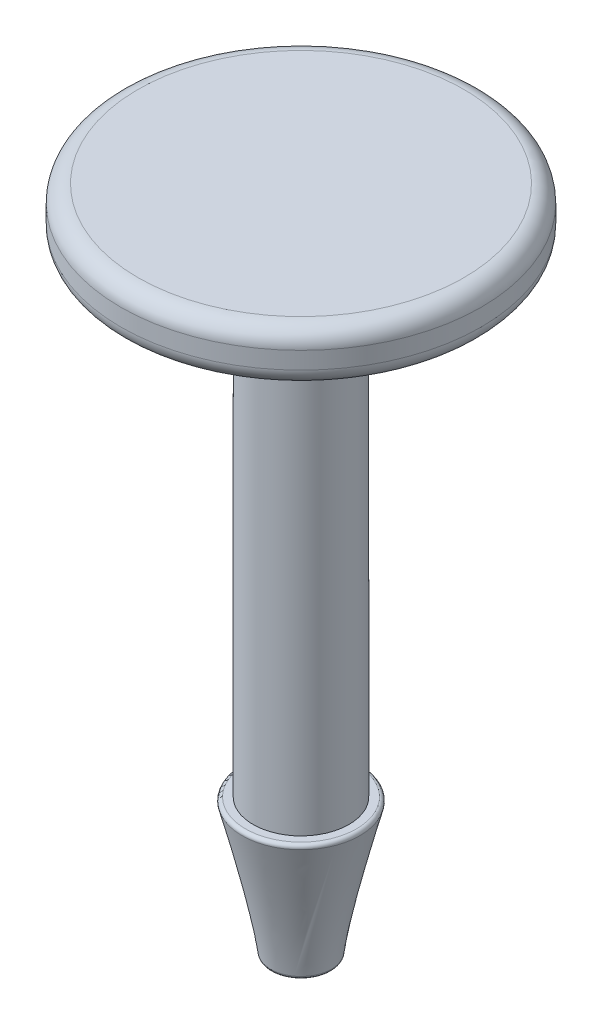
ISO-10303-21;
HEADER;
FILE_DESCRIPTION(('STEP AP214'),'2;1');
FILE_NAME('part.step','',(''),(''),'','','');
FILE_SCHEMA(('AUTOMOTIVE_DESIGN { 1 0 10303 214 1 1 1 1 }'));
ENDSEC;
DATA;
#1=APPLICATION_CONTEXT('core data for automotive mechanical design processes');
#2=APPLICATION_PROTOCOL_DEFINITION('international standard','automotive_design',2000,#1);
#3=PRODUCT_CONTEXT('',#1,'mechanical');
#4=PRODUCT('Part','Part','',(#3));
#5=PRODUCT_RELATED_PRODUCT_CATEGORY('part','',(#4));
#6=PRODUCT_DEFINITION_FORMATION('','',#4);
#7=PRODUCT_DEFINITION_CONTEXT('part definition',#1,'design');
#8=PRODUCT_DEFINITION('design','',#6,#7);
#9=PRODUCT_DEFINITION_SHAPE('','',#8);
#10=(LENGTH_UNIT() NAMED_UNIT(*) SI_UNIT(.MILLI.,.METRE.));
#11=(NAMED_UNIT(*) PLANE_ANGLE_UNIT() SI_UNIT($,.RADIAN.));
#12=(NAMED_UNIT(*) SI_UNIT($,.STERADIAN.) SOLID_ANGLE_UNIT());
#13=UNCERTAINTY_MEASURE_WITH_UNIT(LENGTH_MEASURE(1.E-05),#10,'distance_accuracy_value','');
#14=(GEOMETRIC_REPRESENTATION_CONTEXT(3) GLOBAL_UNCERTAINTY_ASSIGNED_CONTEXT((#13)) GLOBAL_UNIT_ASSIGNED_CONTEXT((#10,
#11,#12)) REPRESENTATION_CONTEXT('',''));
#15=CARTESIAN_POINT('',(0.,0.,0.));
#16=DIRECTION('',(0.,0.,1.));
#17=DIRECTION('',(1.,0.,0.));
#18=AXIS2_PLACEMENT_3D('',#15,#16,#17);
#19=CARTESIAN_POINT('',(0.,19.5,0.));
#20=DIRECTION('',(0.,-1.,0.));
#21=DIRECTION('',(0.,0.,-1.));
#22=AXIS2_PLACEMENT_3D('',#19,#20,#21);
#23=CYLINDRICAL_SURFACE('',#22,5.2575);
#24=CARTESIAN_POINT('',(0.,18.5,0.));
#25=DIRECTION('',(0.,1.,0.));
#26=DIRECTION('',(0.,0.,1.));
#27=AXIS2_PLACEMENT_3D('',#24,#25,#26);
#28=CIRCLE('',#27,5.2575);
#29=CARTESIAN_POINT('',(0.,18.5,5.2575));
#30=VERTEX_POINT('',#29);
#31=EDGE_CURVE('E54',#30,#30,#28,.T.);
#32=ORIENTED_EDGE('',*,*,#31,.T.);
#33=EDGE_LOOP('',(#32));
#34=FACE_BOUND('',#33,.T.);
#35=CARTESIAN_POINT('',(0.,19.,0.));
#36=DIRECTION('',(0.,1.,0.));
#37=DIRECTION('',(0.,0.,1.));
#38=AXIS2_PLACEMENT_3D('',#35,#36,#37);
#39=CIRCLE('',#38,5.2575);
#40=CARTESIAN_POINT('',(0.,19.,5.2575));
#41=VERTEX_POINT('',#40);
#42=EDGE_CURVE('E58',#41,#41,#39,.F.);
#43=ORIENTED_EDGE('',*,*,#42,.T.);
#44=EDGE_LOOP('',(#43));
#45=FACE_BOUND('',#44,.T.);
#46=ADVANCED_FACE('F43',(#34,#45),#23,.T.);
#47=CARTESIAN_POINT('',(0.,19.5,0.));
#48=DIRECTION('',(0.,1.,0.));
#49=DIRECTION('',(0.,0.,1.));
#50=AXIS2_PLACEMENT_3D('',#47,#48,#49);
#51=PLANE('',#50);
#52=CARTESIAN_POINT('',(0.,19.5,0.));
#53=DIRECTION('',(0.,1.,0.));
#54=DIRECTION('',(0.,0.,1.));
#55=AXIS2_PLACEMENT_3D('',#52,#53,#54);
#56=CIRCLE('',#55,4.7575);
#57=CARTESIAN_POINT('',(0.,19.5,4.7575));
#58=VERTEX_POINT('',#57);
#59=EDGE_CURVE('E11',#58,#58,#56,.T.);
#60=ORIENTED_EDGE('',*,*,#59,.T.);
#61=EDGE_LOOP('',(#60));
#62=FACE_BOUND('',#61,.T.);
#63=ADVANCED_FACE('F101',(#62),#51,.T.);
#64=CARTESIAN_POINT('',(0.,18.,0.));
#65=DIRECTION('',(0.,1.,0.));
#66=DIRECTION('',(0.,0.,1.));
#67=AXIS2_PLACEMENT_3D('',#64,#65,#66);
#68=PLANE('',#67);
#69=CARTESIAN_POINT('',(0.,18.,0.));
#70=DIRECTION('',(0.,1.,0.));
#71=DIRECTION('',(0.,0.,1.));
#72=AXIS2_PLACEMENT_3D('',#69,#70,#71);
#73=CIRCLE('',#72,4.7575);
#74=CARTESIAN_POINT('',(0.,18.,4.7575));
#75=VERTEX_POINT('',#74);
#76=EDGE_CURVE('E50',#75,#75,#73,.F.);
#77=ORIENTED_EDGE('',*,*,#76,.T.);
#78=EDGE_LOOP('',(#77));
#79=FACE_BOUND('',#78,.T.);
#80=CARTESIAN_POINT('',(0.,18.,0.));
#81=DIRECTION('',(0.,1.,0.));
#82=DIRECTION('',(0.,0.,1.));
#83=AXIS2_PLACEMENT_3D('',#80,#81,#82);
#84=CIRCLE('',#83,1.5);
#85=CARTESIAN_POINT('',(0.,18.,1.5));
#86=VERTEX_POINT('',#85);
#87=EDGE_CURVE('E63',#86,#86,#84,.T.);
#88=ORIENTED_EDGE('',*,*,#87,.T.);
#89=EDGE_LOOP('',(#88));
#90=FACE_BOUND('',#89,.T.);
#91=ADVANCED_FACE('F89',(#79,#90),#68,.F.);
#92=CARTESIAN_POINT('',(0.,22.9497474683058,0.));
#93=DIRECTION('',(0.,-1.,0.));
#94=DIRECTION('',(0.,0.,-1.));
#95=AXIS2_PLACEMENT_3D('',#92,#93,#94);
#96=CYLINDRICAL_SURFACE('',#95,1.4);
#97=CARTESIAN_POINT('',(0.,17.9,0.));
#98=DIRECTION('',(0.,1.,0.));
#99=DIRECTION('',(0.,0.,1.));
#100=AXIS2_PLACEMENT_3D('',#97,#98,#99);
#101=CIRCLE('',#100,1.4);
#102=CARTESIAN_POINT('',(0.,17.9,1.4));
#103=VERTEX_POINT('',#102);
#104=EDGE_CURVE('E66',#103,#103,#101,.F.);
#105=ORIENTED_EDGE('',*,*,#104,.T.);
#106=EDGE_LOOP('',(#105));
#107=FACE_BOUND('',#106,.T.);
#108=CARTESIAN_POINT('',(0.,4.,0.));
#109=DIRECTION('',(0.,-1.,0.));
#110=DIRECTION('',(0.,0.,-1.));
#111=AXIS2_PLACEMENT_3D('',#108,#109,#110);
#112=CIRCLE('',#111,1.4);
#113=CARTESIAN_POINT('',(0.,4.,-1.4));
#114=VERTEX_POINT('',#113);
#115=EDGE_CURVE('E81',#114,#114,#112,.T.);
#116=ORIENTED_EDGE('',*,*,#115,.F.);
#117=EDGE_LOOP('',(#116));
#118=FACE_BOUND('',#117,.T.);
#119=ADVANCED_FACE('F87',(#107,#118),#96,.T.);
#120=CARTESIAN_POINT('',(0.,4.,0.));
#121=DIRECTION('',(0.,-1.,0.));
#122=DIRECTION('',(0.,0.,-1.));
#123=AXIS2_PLACEMENT_3D('',#120,#121,#122);
#124=PLANE('',#123);
#125=CARTESIAN_POINT('',(0.,4.,0.));
#126=DIRECTION('',(0.,-1.,0.));
#127=DIRECTION('',(0.,0.,-1.));
#128=AXIS2_PLACEMENT_3D('',#125,#126,#127);
#129=CIRCLE('',#128,1.62057432723034);
#130=CARTESIAN_POINT('',(0.,4.,-1.62057432723034));
#131=VERTEX_POINT('',#130);
#132=EDGE_CURVE('E69',#131,#131,#129,.F.);
#133=ORIENTED_EDGE('',*,*,#132,.T.);
#134=EDGE_LOOP('',(#133));
#135=FACE_BOUND('',#134,.T.);
#136=ORIENTED_EDGE('',*,*,#115,.T.);
#137=EDGE_LOOP('',(#136));
#138=FACE_BOUND('',#137,.T.);
#139=ADVANCED_FACE('F85',(#135,#138),#124,.F.);
#140=CARTESIAN_POINT('',(0.,0.,0.));
#141=DIRECTION('',(0.,-1.,0.));
#142=DIRECTION('',(0.,0.,-1.));
#143=AXIS2_PLACEMENT_3D('',#140,#141,#142);
#144=PLANE('',#143);
#145=CARTESIAN_POINT('',(0.,0.,0.));
#146=DIRECTION('',(0.,-1.,0.));
#147=DIRECTION('',(0.,0.,-1.));
#148=AXIS2_PLACEMENT_3D('',#145,#146,#147);
#149=CIRCLE('',#148,0.787739009857068);
#150=CARTESIAN_POINT('',(0.,0.,-0.787739009857068));
#151=VERTEX_POINT('',#150);
#152=EDGE_CURVE('E78',#151,#151,#149,.T.);
#153=ORIENTED_EDGE('',*,*,#152,.T.);
#154=EDGE_LOOP('',(#153));
#155=FACE_BOUND('',#154,.T.);
#156=ADVANCED_FACE('F97',(#155),#144,.T.);
#157=CARTESIAN_POINT('',(1.65205506224684,4.,0.577246976002992));
#158=CARTESIAN_POINT('',(0.493640245574514,0.,0.722457132257087));
#159=CARTESIAN_POINT('',(0.497561110240852,4.,3.88135710049667));
#160=CARTESIAN_POINT('',(-0.95127401893966,0.,1.70973762340612));
#161=CARTESIAN_POINT('',(-2.80654901425282,4.,2.72686314849068));
#162=CARTESIAN_POINT('',(-1.93855451008869,0.,0.264823358891941));
#163=CARTESIAN_POINT('',(-1.65205506224684,4.,-0.577246976002993));
#164=CARTESIAN_POINT('',(-0.493640245574514,0.,-0.722457132257087));
#165=CARTESIAN_POINT('',(-0.497561110240851,4.,-3.88135710049667));
#166=CARTESIAN_POINT('',(0.95127401893966,0.,-1.70973762340611));
#167=CARTESIAN_POINT('',(2.80654901425282,4.,-2.72686314849068));
#168=CARTESIAN_POINT('',(1.93855451008869,0.,-0.26482335889194));
#169=CARTESIAN_POINT('',(1.65205506224684,4.,0.577246976002992));
#170=CARTESIAN_POINT('',(0.493640245574514,0.,0.722457132257087));
#171=(BOUNDED_SURFACE() B_SPLINE_SURFACE(3,1,((#157,#158),(#159,#160),(#161,#162),(#163,#164),
(#165,#166),(#167,#168),(#169,#170)),.UNSPECIFIED.,.T.,.F.,.F.) B_SPLINE_SURFACE_WITH_KNOTS((4,
3,4),(2,2),(0.,0.5,1.),(0.,1.),
.UNSPECIFIED.) GEOMETRIC_REPRESENTATION_ITEM() RATIONAL_B_SPLINE_SURFACE(((1.,1.),
(0.333333333333333,0.333333333333333),(0.333333333333333,0.333333333333333),(1.,1.),
(0.333333333333333,0.333333333333333),(0.333333333333333,0.333333333333333),(1.,1.))) REPRESENTATION_ITEM('') SURFACE());
#172=CARTESIAN_POINT('',(0.,0.0861436469633574,0.));
#173=DIRECTION('',(0.,-1.,0.));
#174=DIRECTION('',(0.,0.,-1.));
#175=AXIS2_PLACEMENT_3D('',#172,#173,#174);
#176=CIRCLE('',#175,0.886774364556912);
#177=CARTESIAN_POINT('',(0.51858776482565,0.0861436469633574,0.719329899148125));
#178=VERTEX_POINT('',#177);
#179=EDGE_CURVE('E72',#178,#178,#176,.F.);
#180=CARTESIAN_POINT('',(0.,3.87482023629564,0.));
#181=DIRECTION('',(0.,-1.,0.));
#182=DIRECTION('',(0.,0.,-1.));
#183=AXIS2_PLACEMENT_3D('',#180,#181,#182);
#184=CIRCLE('',#183,1.7173523180123);
#185=CARTESIAN_POINT('',(1.61580253899117,3.87482023629564,0.581791319264832));
#186=VERTEX_POINT('',#185);
#187=EDGE_CURVE('E75',#186,#186,#184,.T.);
#188=CARTESIAN_POINT('',(0.51858776482565,0.0861436469633574,0.719329899148125));
#189=CARTESIAN_POINT('',(0.530017085389874,0.125609028102235,0.717897205607674));
#190=CARTESIAN_POINT('',(0.541446405954098,0.165074409241113,0.716464512067223));
#191=CARTESIAN_POINT('',(0.564305047082546,0.244005171518869,0.713599124986321));
#192=CARTESIAN_POINT('',(0.575734367646771,0.283470552657747,0.71216643144587));
#193=CARTESIAN_POINT('',(0.598593008775219,0.362401314935503,0.709301044364968));
#194=CARTESIAN_POINT('',(0.610022329339443,0.401866696074381,0.707868350824517));
#195=CARTESIAN_POINT('',(0.632880970467891,0.480797458352137,0.705002963743615));
#196=CARTESIAN_POINT('',(0.644310291032116,0.520262839491015,0.703570270203164));
#197=CARTESIAN_POINT('',(0.667168932160564,0.599193601768771,0.700704883122262));
#198=CARTESIAN_POINT('',(0.678598252724788,0.638658982907649,0.699272189581811));
#199=CARTESIAN_POINT('',(0.701456893853237,0.717589745185405,0.696406802500909));
#200=CARTESIAN_POINT('',(0.712886214417461,0.757055126324283,0.694974108960458));
#201=CARTESIAN_POINT('',(0.735744855545909,0.835985888602038,0.692108721879557));
#202=CARTESIAN_POINT('',(0.747174176110133,0.875451269740916,0.690676028339106));
#203=CARTESIAN_POINT('',(0.770032817238582,0.954382032018672,0.687810641258204));
#204=CARTESIAN_POINT('',(0.781462137802806,0.99384741315755,0.686377947717753));
#205=CARTESIAN_POINT('',(0.804320778931254,1.07277817543531,0.683512560636851));
#206=CARTESIAN_POINT('',(0.815750099495478,1.11224355657418,0.6820798670964));
#207=CARTESIAN_POINT('',(0.838608740623926,1.19117431885194,0.679214480015498));
#208=CARTESIAN_POINT('',(0.850038061188151,1.23063969999082,0.677781786475047));
#209=CARTESIAN_POINT('',(0.872896702316599,1.30957046226857,0.674916399394145));
#210=CARTESIAN_POINT('',(0.884326022880823,1.34903584340745,0.673483705853694));
#211=CARTESIAN_POINT('',(0.907184664009271,1.42796660568521,0.670618318772792));
#212=CARTESIAN_POINT('',(0.918613984573496,1.46743198682409,0.669185625232341));
#213=CARTESIAN_POINT('',(0.941472625701944,1.54636274910184,0.666320238151439));
#214=CARTESIAN_POINT('',(0.952901946266168,1.58582813024072,0.664887544610988));
#215=CARTESIAN_POINT('',(0.975760587394616,1.66475889251848,0.662022157530086));
#216=CARTESIAN_POINT('',(0.987189907958841,1.70422427365735,0.660589463989635));
#217=CARTESIAN_POINT('',(1.01004854908729,1.78315503593511,0.657724076908733));
#218=CARTESIAN_POINT('',(1.02147786965151,1.82262041707399,0.656291383368283));
#219=CARTESIAN_POINT('',(1.04433651077996,1.90155117935174,0.653425996287381));
#220=CARTESIAN_POINT('',(1.05576583134419,1.94101656049062,0.65199330274693));
#221=CARTESIAN_POINT('',(1.07862447247263,2.01994732276838,0.649127915666028));
#222=CARTESIAN_POINT('',(1.09005379303686,2.05941270390725,0.647695222125577));
#223=CARTESIAN_POINT('',(1.11291243416531,2.13834346618501,0.644829835044675));
#224=CARTESIAN_POINT('',(1.12434175472953,2.17780884732389,0.643397141504224));
#225=CARTESIAN_POINT('',(1.14720039585798,2.25673960960165,0.640531754423322));
#226=CARTESIAN_POINT('',(1.1586297164222,2.29620499074052,0.639099060882871));
#227=CARTESIAN_POINT('',(1.18148835755065,2.37513575301828,0.636233673801969));
#228=CARTESIAN_POINT('',(1.19291767811488,2.41460113415716,0.634800980261518));
#229=CARTESIAN_POINT('',(1.21577631924332,2.49353189643491,0.631935593180616));
#230=CARTESIAN_POINT('',(1.22720563980755,2.53299727757379,0.630502899640165));
#231=CARTESIAN_POINT('',(1.250064280936,2.61192803985155,0.627637512559263));
#232=CARTESIAN_POINT('',(1.26149360150022,2.65139342099042,0.626204819018812));
#233=CARTESIAN_POINT('',(1.28435224262867,2.73032418326818,0.62333943193791));
#234=CARTESIAN_POINT('',(1.29578156319289,2.76978956440706,0.621906738397459));
#235=CARTESIAN_POINT('',(1.31864020432134,2.84872032668481,0.619041351316558));
#236=CARTESIAN_POINT('',(1.33006952488557,2.88818570782369,0.617608657776107));
#237=CARTESIAN_POINT('',(1.35292816601401,2.96711647010145,0.614743270695205));
#238=CARTESIAN_POINT('',(1.36435748657824,3.00658185124033,0.613310577154754));
#239=CARTESIAN_POINT('',(1.38721612770669,3.08551261351808,0.610445190073852));
#240=CARTESIAN_POINT('',(1.39864544827091,3.12497799465696,0.609012496533401));
#241=CARTESIAN_POINT('',(1.42150408939936,3.20390875693472,0.606147109452499));
#242=CARTESIAN_POINT('',(1.43293340996358,3.24337413807359,0.604714415912048));
#243=CARTESIAN_POINT('',(1.45579205109203,3.32230490035135,0.601849028831146));
#244=CARTESIAN_POINT('',(1.46722137165626,3.36177028149023,0.600416335290695));
#245=CARTESIAN_POINT('',(1.4900800127847,3.44070104376798,0.597550948209793));
#246=CARTESIAN_POINT('',(1.50150933334893,3.48016642490686,0.596118254669342));
#247=CARTESIAN_POINT('',(1.52436797447738,3.55909718718462,0.59325286758844));
#248=CARTESIAN_POINT('',(1.5357972950416,3.59856256832349,0.591820174047989));
#249=CARTESIAN_POINT('',(1.55865593617005,3.67749333060125,0.588954786967087));
#250=CARTESIAN_POINT('',(1.57008525673427,3.71695871174013,0.587522093426636));
#251=CARTESIAN_POINT('',(1.59294389786272,3.79588947401789,0.584656706345734));
#252=CARTESIAN_POINT('',(1.60437321842695,3.83535485515676,0.583224012805284));
#253=CARTESIAN_POINT('',(1.61580253899117,3.87482023629564,0.581791319264833));
#254=B_SPLINE_CURVE_WITH_KNOTS('',3,(#188,#189,#190,#191,#192,#193,#194,#195,#196,#197,#198,
#199,#200,#201,#202,#203,#204,#205,#206,#207,#208,#209,#210,#211,#212,#213,#214,#215,#216,#217,
#218,#219,#220,#221,#222,#223,#224,#225,#226,#227,#228,#229,#230,#231,#232,#233,#234,#235,#236,
#237,#238,#239,#240,#241,#242,#243,#244,#245,#246,#247,#248,#249,#250,#251,#252,#253),
.UNSPECIFIED.,.F.,.F.,(4,2,2,2,2,2,2,2,2,2,2,2,2,2,2,2,2,2,2,2,2,2,2,2,2,2,2,2,2,2,2,2,4),(0.,
0.123336063622924,0.246672127245848,0.370008190868772,0.493344254491696,0.61668031811462,
0.740016381737544,0.863352445360468,0.986688508983392,1.11002457260632,1.23336063622924,
1.35669669985216,1.48003276347509,1.60336882709801,1.72670489072094,1.85004095434386,
1.97337701796678,2.09671308158971,2.22004914521263,2.34338520883556,2.46672127245848,
2.5900573360814,2.71339339970433,2.83672946332725,2.96006552695018,3.0834015905731,
3.20673765419602,3.33007371781895,3.45340978144187,3.5767458450648,3.70008190868772,
3.82341797231065,3.94675403593357),.UNSPECIFIED.);
#255=EDGE_CURVE('BSEAM117',#178,#186,#254,.T.);
#256=ORIENTED_EDGE('',*,*,#179,.T.);
#257=ORIENTED_EDGE('',*,*,#187,.T.);
#258=ORIENTED_EDGE('',*,*,#255,.T.);
#259=ORIENTED_EDGE('',*,*,#255,.F.);
#260=EDGE_LOOP('',(#256,#258,#257,#259));
#261=FACE_BOUND('',#260,.T.);
#262=ADVANCED_FACE('F117',(#261),#171,.T.);
#263=CARTESIAN_POINT('',(0.,0.0999999999999994,0.));
#264=DIRECTION('',(0.,-1.,0.));
#265=DIRECTION('',(0.,0.,-1.));
#266=AXIS2_PLACEMENT_3D('',#263,#264,#265);
#267=TOROIDAL_SURFACE('',#266,0.787739009857068,0.1);
#268=ORIENTED_EDGE('',*,*,#179,.F.);
#269=EDGE_LOOP('',(#268));
#270=FACE_BOUND('',#269,.T.);
#271=ORIENTED_EDGE('',*,*,#152,.F.);
#272=EDGE_LOOP('',(#271));
#273=FACE_BOUND('',#272,.T.);
#274=ADVANCED_FACE('F113',(#270,#273),#267,.T.);
#275=CARTESIAN_POINT('',(0.,3.9,0.));
#276=DIRECTION('',(0.,-1.,0.));
#277=DIRECTION('',(0.,0.,-1.));
#278=AXIS2_PLACEMENT_3D('',#275,#276,#277);
#279=TOROIDAL_SURFACE('',#278,1.62057432723034,0.1);
#280=ORIENTED_EDGE('',*,*,#132,.F.);
#281=EDGE_LOOP('',(#280));
#282=FACE_BOUND('',#281,.T.);
#283=ORIENTED_EDGE('',*,*,#187,.F.);
#284=EDGE_LOOP('',(#283));
#285=FACE_BOUND('',#284,.T.);
#286=ADVANCED_FACE('F116',(#282,#285),#279,.T.);
#287=CARTESIAN_POINT('',(0.,17.9,0.));
#288=DIRECTION('',(0.,1.,0.));
#289=DIRECTION('',(0.,0.,1.));
#290=AXIS2_PLACEMENT_3D('',#287,#288,#289);
#291=TOROIDAL_SURFACE('',#290,1.5,0.1);
#292=ORIENTED_EDGE('',*,*,#87,.F.);
#293=EDGE_LOOP('',(#292));
#294=FACE_BOUND('',#293,.T.);
#295=ORIENTED_EDGE('',*,*,#104,.F.);
#296=EDGE_LOOP('',(#295));
#297=FACE_BOUND('',#296,.T.);
#298=ADVANCED_FACE('F120',(#294,#297),#291,.F.);
#299=CARTESIAN_POINT('',(0.,18.5,0.));
#300=DIRECTION('',(0.,1.,0.));
#301=DIRECTION('',(0.,0.,1.));
#302=AXIS2_PLACEMENT_3D('',#299,#300,#301);
#303=TOROIDAL_SURFACE('',#302,4.7575,0.5);
#304=ORIENTED_EDGE('',*,*,#76,.F.);
#305=EDGE_LOOP('',(#304));
#306=FACE_BOUND('',#305,.T.);
#307=ORIENTED_EDGE('',*,*,#31,.F.);
#308=EDGE_LOOP('',(#307));
#309=FACE_BOUND('',#308,.T.);
#310=ADVANCED_FACE('F122',(#306,#309),#303,.T.);
#311=CARTESIAN_POINT('',(0.,19.,0.));
#312=DIRECTION('',(0.,1.,0.));
#313=DIRECTION('',(0.,0.,1.));
#314=AXIS2_PLACEMENT_3D('',#311,#312,#313);
#315=TOROIDAL_SURFACE('',#314,4.7575,0.5);
#316=ORIENTED_EDGE('',*,*,#42,.F.);
#317=EDGE_LOOP('',(#316));
#318=FACE_BOUND('',#317,.T.);
#319=ORIENTED_EDGE('',*,*,#59,.F.);
#320=EDGE_LOOP('',(#319));
#321=FACE_BOUND('',#320,.T.);
#322=ADVANCED_FACE('F45',(#318,#321),#315,.T.);
#323=CLOSED_SHELL('',(#46,#63,#91,#119,#139,#156,#262,#274,#286,#298,#310,#322));
#324=MANIFOLD_SOLID_BREP('B2',#323);
#325=ADVANCED_BREP_SHAPE_REPRESENTATION('',(#18,#324),#14);
#326=SHAPE_DEFINITION_REPRESENTATION(#9,#325);
ENDSEC;
END-ISO-10303-21;
